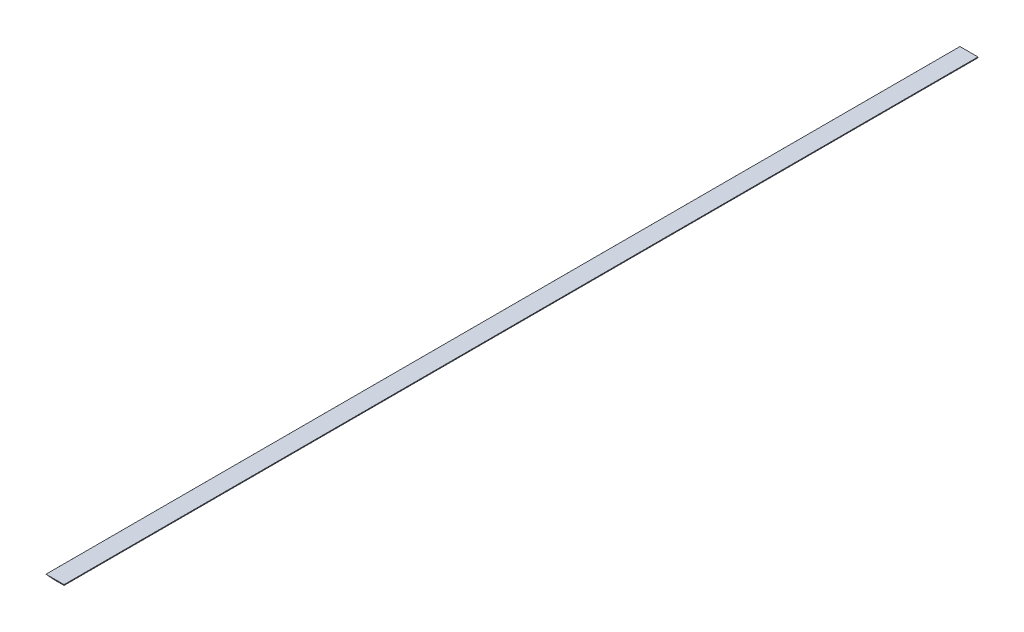
ISO-10303-21;
HEADER;
FILE_DESCRIPTION(('STEP AP214'),'2;1');
FILE_NAME('part.step','',(''),(''),'','','');
FILE_SCHEMA(('AUTOMOTIVE_DESIGN { 1 0 10303 214 1 1 1 1 }'));
ENDSEC;
DATA;
#1=APPLICATION_CONTEXT('core data for automotive mechanical design processes');
#2=APPLICATION_PROTOCOL_DEFINITION('international standard','automotive_design',2000,#1);
#3=PRODUCT_CONTEXT('',#1,'mechanical');
#4=PRODUCT('Part','Part','',(#3));
#5=PRODUCT_RELATED_PRODUCT_CATEGORY('part','',(#4));
#6=PRODUCT_DEFINITION_FORMATION('','',#4);
#7=PRODUCT_DEFINITION_CONTEXT('part definition',#1,'design');
#8=PRODUCT_DEFINITION('design','',#6,#7);
#9=PRODUCT_DEFINITION_SHAPE('','',#8);
#10=(LENGTH_UNIT() NAMED_UNIT(*) SI_UNIT(.MILLI.,.METRE.));
#11=(NAMED_UNIT(*) PLANE_ANGLE_UNIT() SI_UNIT($,.RADIAN.));
#12=(NAMED_UNIT(*) SI_UNIT($,.STERADIAN.) SOLID_ANGLE_UNIT());
#13=UNCERTAINTY_MEASURE_WITH_UNIT(LENGTH_MEASURE(1.E-05),#10,'distance_accuracy_value','');
#14=(GEOMETRIC_REPRESENTATION_CONTEXT(3) GLOBAL_UNCERTAINTY_ASSIGNED_CONTEXT((#13)) GLOBAL_UNIT_ASSIGNED_CONTEXT((#10,
#11,#12)) REPRESENTATION_CONTEXT('',''));
#15=CARTESIAN_POINT('',(0.,0.,0.));
#16=DIRECTION('',(0.,0.,1.));
#17=DIRECTION('',(1.,0.,0.));
#18=AXIS2_PLACEMENT_3D('',#15,#16,#17);
#19=CARTESIAN_POINT('',(-47.625,4.16664760042215,5000.));
#20=DIRECTION('',(0.0871557427476585,0.996194698091746,0.));
#21=DIRECTION('',(-0.996194698091746,0.0871557427476585,0.));
#22=AXIS2_PLACEMENT_3D('',#19,#20,#21);
#23=PLANE('',#22);
#24=DIRECTION('',(0.996194698091745,-0.0871557427476585,0.));
#25=VECTOR('',#24,1.);
#26=CARTESIAN_POINT('',(-47.625,4.16664760042215,5000.));
#27=LINE('',#26,#25);
#28=CARTESIAN_POINT('',(-44.7272905546782,3.9131308737645,5000.));
#29=VERTEX_POINT('',#28);
#30=CARTESIAN_POINT('',(0.,0.,5000.));
#31=VERTEX_POINT('',#30);
#32=EDGE_CURVE('E83',#29,#31,#27,.T.);
#33=ORIENTED_EDGE('',*,*,#32,.F.);
#34=DIRECTION('',(0.,0.,-1.));
#35=VECTOR('',#34,1.);
#36=CARTESIAN_POINT('',(-44.7272905546782,3.9131308737645,5000.));
#37=LINE('',#36,#35);
#38=CARTESIAN_POINT('',(-44.7272905546782,3.9131308737645,0.));
#39=VERTEX_POINT('',#38);
#40=EDGE_CURVE('E106',#29,#39,#37,.T.);
#41=ORIENTED_EDGE('',*,*,#40,.T.);
#42=DIRECTION('',(0.996194698091745,-0.0871557427476585,0.));
#43=VECTOR('',#42,1.);
#44=CARTESIAN_POINT('',(-47.625,4.16664760042215,0.));
#45=LINE('',#44,#43);
#46=CARTESIAN_POINT('',(0.,0.,0.));
#47=VERTEX_POINT('',#46);
#48=EDGE_CURVE('E104',#39,#47,#45,.T.);
#49=ORIENTED_EDGE('',*,*,#48,.T.);
#50=DIRECTION('',(0.,0.,-1.));
#51=VECTOR('',#50,1.);
#52=CARTESIAN_POINT('',(0.,0.,5000.));
#53=LINE('',#52,#51);
#54=EDGE_CURVE('E98',#31,#47,#53,.T.);
#55=ORIENTED_EDGE('',*,*,#54,.F.);
#56=EDGE_LOOP('',(#33,#41,#49,#55));
#57=FACE_BOUND('',#56,.T.);
#58=ADVANCED_FACE('F37',(#57),#23,.F.);
#59=CARTESIAN_POINT('',(0.,0.,5000.));
#60=DIRECTION('',(0.,1.,0.));
#61=DIRECTION('',(0.,0.,1.));
#62=AXIS2_PLACEMENT_3D('',#59,#60,#61);
#63=PLANE('',#62);
#64=DIRECTION('',(1.,0.,0.));
#65=VECTOR('',#64,1.);
#66=CARTESIAN_POINT('',(0.,0.,0.));
#67=LINE('',#66,#65);
#68=CARTESIAN_POINT('',(53.975,0.,0.));
#69=VERTEX_POINT('',#68);
#70=EDGE_CURVE('E119',#47,#69,#67,.T.);
#71=ORIENTED_EDGE('',*,*,#70,.T.);
#72=DIRECTION('',(0.,0.,-1.));
#73=VECTOR('',#72,1.);
#74=CARTESIAN_POINT('',(53.975,0.,5000.));
#75=LINE('',#74,#73);
#76=CARTESIAN_POINT('',(53.975,0.,5000.));
#77=VERTEX_POINT('',#76);
#78=EDGE_CURVE('E100',#77,#69,#75,.T.);
#79=ORIENTED_EDGE('',*,*,#78,.F.);
#80=DIRECTION('',(1.,0.,0.));
#81=VECTOR('',#80,1.);
#82=CARTESIAN_POINT('',(0.,0.,5000.));
#83=LINE('',#82,#81);
#84=EDGE_CURVE('E86',#31,#77,#83,.T.);
#85=ORIENTED_EDGE('',*,*,#84,.F.);
#86=ORIENTED_EDGE('',*,*,#54,.T.);
#87=EDGE_LOOP('',(#71,#79,#85,#86));
#88=FACE_BOUND('',#87,.T.);
#89=ADVANCED_FACE('F97',(#88),#63,.F.);
#90=CARTESIAN_POINT('',(53.975,0.,5000.));
#91=DIRECTION('',(-1.,0.,0.));
#92=DIRECTION('',(0.,0.,1.));
#93=AXIS2_PLACEMENT_3D('',#90,#91,#92);
#94=PLANE('',#93);
#95=DIRECTION('',(0.,1.,0.));
#96=VECTOR('',#95,1.);
#97=CARTESIAN_POINT('',(53.975,0.,0.));
#98=LINE('',#97,#96);
#99=CARTESIAN_POINT('',(53.975,4.16664760042216,0.));
#100=VERTEX_POINT('',#99);
#101=EDGE_CURVE('E117',#69,#100,#98,.T.);
#102=ORIENTED_EDGE('',*,*,#101,.T.);
#103=DIRECTION('',(0.,0.,-1.));
#104=VECTOR('',#103,1.);
#105=CARTESIAN_POINT('',(53.975,4.16664760042216,5000.));
#106=LINE('',#105,#104);
#107=CARTESIAN_POINT('',(53.975,4.16664760042216,5000.));
#108=VERTEX_POINT('',#107);
#109=EDGE_CURVE('E109',#108,#100,#106,.T.);
#110=ORIENTED_EDGE('',*,*,#109,.F.);
#111=DIRECTION('',(0.,1.,0.));
#112=VECTOR('',#111,1.);
#113=CARTESIAN_POINT('',(53.975,0.,5000.));
#114=LINE('',#113,#112);
#115=EDGE_CURVE('E102',#77,#108,#114,.T.);
#116=ORIENTED_EDGE('',*,*,#115,.F.);
#117=ORIENTED_EDGE('',*,*,#78,.T.);
#118=EDGE_LOOP('',(#102,#110,#116,#117));
#119=FACE_BOUND('',#118,.T.);
#120=ADVANCED_FACE('F125',(#119),#94,.F.);
#121=CARTESIAN_POINT('',(53.975,4.16664760042216,5000.));
#122=DIRECTION('',(0.,-1.,0.));
#123=DIRECTION('',(1.,0.,0.));
#124=AXIS2_PLACEMENT_3D('',#121,#122,#123);
#125=PLANE('',#124);
#126=DIRECTION('',(-1.,0.,0.));
#127=VECTOR('',#126,1.);
#128=CARTESIAN_POINT('',(53.975,4.16664760042216,0.));
#129=LINE('',#128,#127);
#130=CARTESIAN_POINT('',(-44.7162217753493,4.16664760042215,0.));
#131=VERTEX_POINT('',#130);
#132=EDGE_CURVE('E93',#100,#131,#129,.T.);
#133=ORIENTED_EDGE('',*,*,#132,.T.);
#134=DIRECTION('',(0.,0.,-1.));
#135=VECTOR('',#134,1.);
#136=CARTESIAN_POINT('',(-44.7162217753493,4.16664760042215,5000.));
#137=LINE('',#136,#135);
#138=CARTESIAN_POINT('',(-44.7162217753493,4.16664760042215,5000.));
#139=VERTEX_POINT('',#138);
#140=EDGE_CURVE('E45',#131,#139,#137,.F.);
#141=ORIENTED_EDGE('',*,*,#140,.T.);
#142=DIRECTION('',(-1.,0.,0.));
#143=VECTOR('',#142,1.);
#144=CARTESIAN_POINT('',(53.975,4.16664760042216,5000.));
#145=LINE('',#144,#143);
#146=EDGE_CURVE('E115',#108,#139,#145,.T.);
#147=ORIENTED_EDGE('',*,*,#146,.F.);
#148=ORIENTED_EDGE('',*,*,#109,.T.);
#149=EDGE_LOOP('',(#133,#141,#147,#148));
#150=FACE_BOUND('',#149,.T.);
#151=ADVANCED_FACE('F127',(#150),#125,.F.);
#152=CARTESIAN_POINT('',(0.,0.,5000.));
#153=DIRECTION('',(0.,0.,1.));
#154=DIRECTION('',(1.,0.,0.));
#155=AXIS2_PLACEMENT_3D('',#152,#153,#154);
#156=PLANE('',#155);
#157=ORIENTED_EDGE('',*,*,#146,.T.);
#158=CARTESIAN_POINT('',(-44.7162217753492,4.03964760042215,5000.));
#159=DIRECTION('',(0.,0.,1.));
#160=DIRECTION('',(1.,0.,0.));
#161=AXIS2_PLACEMENT_3D('',#158,#159,#160);
#162=CIRCLE('',#161,0.127);
#163=EDGE_CURVE('E11',#139,#29,#162,.T.);
#164=ORIENTED_EDGE('',*,*,#163,.T.);
#165=ORIENTED_EDGE('',*,*,#32,.T.);
#166=ORIENTED_EDGE('',*,*,#84,.T.);
#167=ORIENTED_EDGE('',*,*,#115,.T.);
#168=EDGE_LOOP('',(#157,#164,#165,#166,#167));
#169=FACE_BOUND('',#168,.T.);
#170=ADVANCED_FACE('F85',(#169),#156,.T.);
#171=CARTESIAN_POINT('',(0.,0.,0.));
#172=DIRECTION('',(0.,0.,1.));
#173=DIRECTION('',(1.,0.,0.));
#174=AXIS2_PLACEMENT_3D('',#171,#172,#173);
#175=PLANE('',#174);
#176=ORIENTED_EDGE('',*,*,#48,.F.);
#177=CARTESIAN_POINT('',(-44.7162217753492,4.03964760042215,0.));
#178=DIRECTION('',(0.,0.,1.));
#179=DIRECTION('',(1.,0.,0.));
#180=AXIS2_PLACEMENT_3D('',#177,#178,#179);
#181=CIRCLE('',#180,0.127);
#182=EDGE_CURVE('E59',#39,#131,#181,.F.);
#183=ORIENTED_EDGE('',*,*,#182,.T.);
#184=ORIENTED_EDGE('',*,*,#132,.F.);
#185=ORIENTED_EDGE('',*,*,#101,.F.);
#186=ORIENTED_EDGE('',*,*,#70,.F.);
#187=EDGE_LOOP('',(#176,#183,#184,#185,#186));
#188=FACE_BOUND('',#187,.T.);
#189=ADVANCED_FACE('F134',(#188),#175,.F.);
#190=CARTESIAN_POINT('',(-44.7162217753492,4.03964760042215,5000.));
#191=DIRECTION('',(0.,0.,-1.));
#192=DIRECTION('',(-1.,0.,0.));
#193=AXIS2_PLACEMENT_3D('',#190,#191,#192);
#194=CYLINDRICAL_SURFACE('',#193,0.127);
#195=ORIENTED_EDGE('',*,*,#163,.F.);
#196=ORIENTED_EDGE('',*,*,#140,.F.);
#197=ORIENTED_EDGE('',*,*,#182,.F.);
#198=ORIENTED_EDGE('',*,*,#40,.F.);
#199=EDGE_LOOP('',(#195,#196,#197,#198));
#200=FACE_BOUND('',#199,.T.);
#201=ADVANCED_FACE('F39',(#200),#194,.T.);
#202=CLOSED_SHELL('',(#58,#89,#120,#151,#170,#189,#201));
#203=MANIFOLD_SOLID_BREP('B2',#202);
#204=ADVANCED_BREP_SHAPE_REPRESENTATION('',(#18,#203),#14);
#205=SHAPE_DEFINITION_REPRESENTATION(#9,#204);
ENDSEC;
END-ISO-10303-21;
